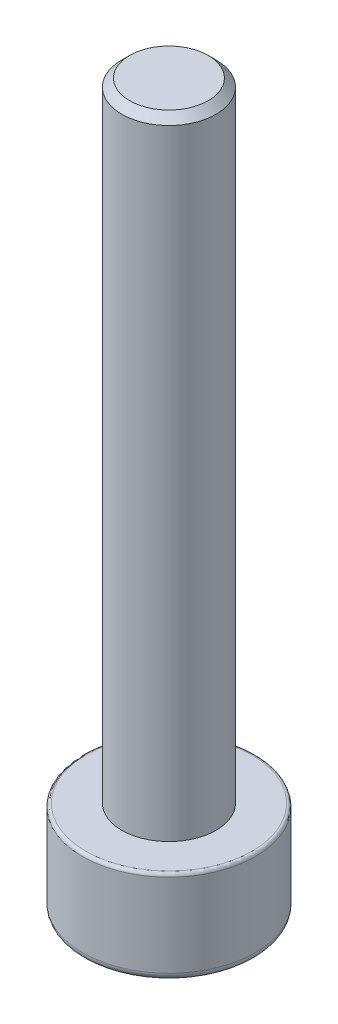
ISO-10303-21;
HEADER;
FILE_DESCRIPTION(('STEP AP214'),'2;1');
FILE_NAME('part.step','',(''),(''),'','','');
FILE_SCHEMA(('AUTOMOTIVE_DESIGN { 1 0 10303 214 1 1 1 1 }'));
ENDSEC;
DATA;
#1=APPLICATION_CONTEXT('core data for automotive mechanical design processes');
#2=APPLICATION_PROTOCOL_DEFINITION('international standard','automotive_design',2000,#1);
#3=PRODUCT_CONTEXT('',#1,'mechanical');
#4=PRODUCT('Part','Part','',(#3));
#5=PRODUCT_RELATED_PRODUCT_CATEGORY('part','',(#4));
#6=PRODUCT_DEFINITION_FORMATION('','',#4);
#7=PRODUCT_DEFINITION_CONTEXT('part definition',#1,'design');
#8=PRODUCT_DEFINITION('design','',#6,#7);
#9=PRODUCT_DEFINITION_SHAPE('','',#8);
#10=(LENGTH_UNIT() NAMED_UNIT(*) SI_UNIT(.MILLI.,.METRE.));
#11=(NAMED_UNIT(*) PLANE_ANGLE_UNIT() SI_UNIT($,.RADIAN.));
#12=(NAMED_UNIT(*) SI_UNIT($,.STERADIAN.) SOLID_ANGLE_UNIT());
#13=UNCERTAINTY_MEASURE_WITH_UNIT(LENGTH_MEASURE(1.E-05),#10,'distance_accuracy_value','');
#14=(GEOMETRIC_REPRESENTATION_CONTEXT(3) GLOBAL_UNCERTAINTY_ASSIGNED_CONTEXT((#13)) GLOBAL_UNIT_ASSIGNED_CONTEXT((#10,
#11,#12)) REPRESENTATION_CONTEXT('',''));
#15=CARTESIAN_POINT('',(0.,0.,0.));
#16=DIRECTION('',(0.,0.,1.));
#17=DIRECTION('',(1.,0.,0.));
#18=AXIS2_PLACEMENT_3D('',#15,#16,#17);
#19=CARTESIAN_POINT('',(0.,3.,0.));
#20=DIRECTION('',(0.,-1.,0.));
#21=DIRECTION('',(0.,0.,-1.));
#22=AXIS2_PLACEMENT_3D('',#19,#20,#21);
#23=CYLINDRICAL_SURFACE('',#22,2.75);
#24=CARTESIAN_POINT('',(0.,2.9,0.));
#25=DIRECTION('',(0.,1.,0.));
#26=DIRECTION('',(0.,0.,1.));
#27=AXIS2_PLACEMENT_3D('',#24,#25,#26);
#28=CIRCLE('',#27,2.75);
#29=CARTESIAN_POINT('',(0.,2.9,2.75));
#30=VERTEX_POINT('',#29);
#31=EDGE_CURVE('E11',#30,#30,#28,.F.);
#32=ORIENTED_EDGE('',*,*,#31,.T.);
#33=EDGE_LOOP('',(#32));
#34=FACE_BOUND('',#33,.T.);
#35=CARTESIAN_POINT('',(0.,0.25,0.));
#36=DIRECTION('',(0.,1.,0.));
#37=DIRECTION('',(0.,0.,1.));
#38=AXIS2_PLACEMENT_3D('',#35,#36,#37);
#39=CIRCLE('',#38,2.75);
#40=CARTESIAN_POINT('',(0.,0.25,2.75));
#41=VERTEX_POINT('',#40);
#42=EDGE_CURVE('E177',#41,#41,#39,.T.);
#43=ORIENTED_EDGE('',*,*,#42,.T.);
#44=EDGE_LOOP('',(#43));
#45=FACE_BOUND('',#44,.T.);
#46=ADVANCED_FACE('F33',(#34,#45),#23,.T.);
#47=CARTESIAN_POINT('',(0.,3.,0.));
#48=DIRECTION('',(0.,1.,0.));
#49=DIRECTION('',(0.,0.,1.));
#50=AXIS2_PLACEMENT_3D('',#47,#48,#49);
#51=PLANE('',#50);
#52=CARTESIAN_POINT('',(0.,3.,0.));
#53=DIRECTION('',(0.,1.,0.));
#54=DIRECTION('',(0.,0.,1.));
#55=AXIS2_PLACEMENT_3D('',#52,#53,#54);
#56=CIRCLE('',#55,2.65);
#57=CARTESIAN_POINT('',(0.,3.,2.65));
#58=VERTEX_POINT('',#57);
#59=EDGE_CURVE('E41',#58,#58,#56,.T.);
#60=ORIENTED_EDGE('',*,*,#59,.T.);
#61=EDGE_LOOP('',(#60));
#62=FACE_BOUND('',#61,.T.);
#63=CARTESIAN_POINT('',(0.,3.,0.));
#64=DIRECTION('',(0.,1.,0.));
#65=DIRECTION('',(0.,0.,1.));
#66=AXIS2_PLACEMENT_3D('',#63,#64,#65);
#67=CIRCLE('',#66,1.5);
#68=CARTESIAN_POINT('',(0.,3.,1.5));
#69=VERTEX_POINT('',#68);
#70=EDGE_CURVE('E141',#69,#69,#67,.T.);
#71=ORIENTED_EDGE('',*,*,#70,.F.);
#72=EDGE_LOOP('',(#71));
#73=FACE_BOUND('',#72,.T.);
#74=ADVANCED_FACE('F203',(#62,#73),#51,.T.);
#75=CARTESIAN_POINT('',(0.,0.,0.));
#76=DIRECTION('',(0.,1.,0.));
#77=DIRECTION('',(0.,0.,1.));
#78=AXIS2_PLACEMENT_3D('',#75,#76,#77);
#79=PLANE('',#78);
#80=CARTESIAN_POINT('',(0.,0.,0.));
#81=DIRECTION('',(0.,1.,0.));
#82=DIRECTION('',(0.,0.,1.));
#83=AXIS2_PLACEMENT_3D('',#80,#81,#82);
#84=CIRCLE('',#83,2.5);
#85=CARTESIAN_POINT('',(0.,0.,2.5));
#86=VERTEX_POINT('',#85);
#87=EDGE_CURVE('E192',#86,#86,#84,.F.);
#88=ORIENTED_EDGE('',*,*,#87,.T.);
#89=EDGE_LOOP('',(#88));
#90=FACE_BOUND('',#89,.T.);
#91=DIRECTION('',(-0.69197693122312,0.,-0.721919612321922));
#92=VECTOR('',#91,1.);
#93=CARTESIAN_POINT('',(1.02450088015783,0.,-0.982008194523005));
#94=LINE('',#93,#92);
#95=CARTESIAN_POINT('',(1.5914635756121,0.,-0.390512335578875));
#96=VERTEX_POINT('',#95);
#97=CARTESIAN_POINT('',(0.457538184703552,0.,-1.57350405346713));
#98=VERTEX_POINT('',#97);
#99=EDGE_CURVE('E156',#96,#98,#94,.T.);
#100=ORIENTED_EDGE('',*,*,#99,.T.);
#101=DIRECTION('',(-0.971189189372558,0.,0.238309795111058));
#102=VECTOR('',#101,1.);
#103=CARTESIAN_POINT('',(-0.338193603102499,0.,-1.3782478856777));
#104=LINE('',#103,#102);
#105=CARTESIAN_POINT('',(-1.13392539090855,0.,-1.18299171788826));
#106=VERTEX_POINT('',#105);
#107=EDGE_CURVE('E166',#98,#106,#104,.T.);
#108=ORIENTED_EDGE('',*,*,#107,.T.);
#109=DIRECTION('',(-0.279212258149438,0.,0.96022940743298));
#110=VECTOR('',#109,1.);
#111=CARTESIAN_POINT('',(-1.36269448326033,0.,-0.396239691154692));
#112=LINE('',#111,#110);
#113=CARTESIAN_POINT('',(-1.5914635756121,0.,0.390512335578874));
#114=VERTEX_POINT('',#113);
#115=EDGE_CURVE('E164',#106,#114,#112,.T.);
#116=ORIENTED_EDGE('',*,*,#115,.T.);
#117=DIRECTION('',(0.69197693122312,0.,0.721919612321922));
#118=VECTOR('',#117,1.);
#119=CARTESIAN_POINT('',(-1.02450088015783,0.,0.982008194523004));
#120=LINE('',#119,#118);
#121=CARTESIAN_POINT('',(-0.457538184703551,0.,1.57350405346713));
#122=VERTEX_POINT('',#121);
#123=EDGE_CURVE('E162',#114,#122,#120,.T.);
#124=ORIENTED_EDGE('',*,*,#123,.T.);
#125=DIRECTION('',(0.971189189372558,0.,-0.238309795111058));
#126=VECTOR('',#125,1.);
#127=CARTESIAN_POINT('',(0.338193603102499,0.,1.3782478856777));
#128=LINE('',#127,#126);
#129=CARTESIAN_POINT('',(1.13392539090855,0.,1.18299171788826));
#130=VERTEX_POINT('',#129);
#131=EDGE_CURVE('E160',#122,#130,#128,.T.);
#132=ORIENTED_EDGE('',*,*,#131,.T.);
#133=DIRECTION('',(0.279212258149438,0.,-0.96022940743298));
#134=VECTOR('',#133,1.);
#135=CARTESIAN_POINT('',(1.36269448326033,0.,0.396239691154693));
#136=LINE('',#135,#134);
#137=EDGE_CURVE('E158',#130,#96,#136,.T.);
#138=ORIENTED_EDGE('',*,*,#137,.T.);
#139=EDGE_LOOP('',(#100,#108,#116,#124,#132,#138));
#140=FACE_BOUND('',#139,.T.);
#141=ADVANCED_FACE('F221',(#90,#140),#79,.F.);
#142=CARTESIAN_POINT('',(0.,23.,0.));
#143=DIRECTION('',(0.,-1.,0.));
#144=DIRECTION('',(0.,0.,-1.));
#145=AXIS2_PLACEMENT_3D('',#142,#143,#144);
#146=CYLINDRICAL_SURFACE('',#145,1.5);
#147=CARTESIAN_POINT('',(0.,22.75,0.));
#148=DIRECTION('',(0.,1.,0.));
#149=DIRECTION('',(0.,0.,1.));
#150=AXIS2_PLACEMENT_3D('',#147,#148,#149);
#151=CIRCLE('',#150,1.5);
#152=CARTESIAN_POINT('',(0.,22.75,1.5));
#153=VERTEX_POINT('',#152);
#154=EDGE_CURVE('E198',#153,#153,#151,.F.);
#155=ORIENTED_EDGE('',*,*,#154,.T.);
#156=EDGE_LOOP('',(#155));
#157=FACE_BOUND('',#156,.T.);
#158=ORIENTED_EDGE('',*,*,#70,.T.);
#159=EDGE_LOOP('',(#158));
#160=FACE_BOUND('',#159,.T.);
#161=ADVANCED_FACE('F260',(#157,#160),#146,.T.);
#162=CARTESIAN_POINT('',(0.,23.,0.));
#163=DIRECTION('',(0.,1.,0.));
#164=DIRECTION('',(0.,0.,1.));
#165=AXIS2_PLACEMENT_3D('',#162,#163,#164);
#166=PLANE('',#165);
#167=CARTESIAN_POINT('',(0.,23.,0.));
#168=DIRECTION('',(0.,1.,0.));
#169=DIRECTION('',(0.,0.,1.));
#170=AXIS2_PLACEMENT_3D('',#167,#168,#169);
#171=CIRCLE('',#170,1.24999999999999);
#172=CARTESIAN_POINT('',(0.,23.,1.24999999999999));
#173=VERTEX_POINT('',#172);
#174=EDGE_CURVE('E195',#173,#173,#171,.T.);
#175=ORIENTED_EDGE('',*,*,#174,.T.);
#176=EDGE_LOOP('',(#175));
#177=FACE_BOUND('',#176,.T.);
#178=ADVANCED_FACE('F299',(#177),#166,.T.);
#179=CARTESIAN_POINT('',(1.31110540565295,1.5,-0.321718223399928));
#180=DIRECTION('',(0.96022940743298,0.,0.279212258149438));
#181=DIRECTION('',(0.279212258149438,0.,-0.96022940743298));
#182=AXIS2_PLACEMENT_3D('',#179,#180,#181);
#183=PLANE('',#182);
#184=DIRECTION('',(0.,-1.,0.));
#185=VECTOR('',#184,1.);
#186=CARTESIAN_POINT('',(1.31110540565295,1.5,-0.321718223399928));
#187=LINE('',#186,#185);
#188=CARTESIAN_POINT('',(1.31110540565295,1.5,-0.321718223399928));
#189=VERTEX_POINT('',#188);
#190=CARTESIAN_POINT('',(1.31110540565295,0.25,-0.321718223399928));
#191=VERTEX_POINT('',#190);
#192=EDGE_CURVE('E139',#189,#191,#187,.T.);
#193=ORIENTED_EDGE('',*,*,#192,.T.);
#194=DIRECTION('',(-0.279212258149438,0.,0.96022940743298));
#195=VECTOR('',#194,1.);
#196=CARTESIAN_POINT('',(1.31110540565295,0.25,-0.321718223399928));
#197=LINE('',#196,#195);
#198=CARTESIAN_POINT('',(0.934168857151212,0.25,0.974591476634595));
#199=VERTEX_POINT('',#198);
#200=EDGE_CURVE('E55',#191,#199,#197,.T.);
#201=ORIENTED_EDGE('',*,*,#200,.T.);
#202=DIRECTION('',(0.,-1.,0.));
#203=VECTOR('',#202,1.);
#204=CARTESIAN_POINT('',(0.934168857151212,1.5,0.974591476634595));
#205=LINE('',#204,#203);
#206=CARTESIAN_POINT('',(0.934168857151212,1.5,0.974591476634595));
#207=VERTEX_POINT('',#206);
#208=EDGE_CURVE('E103',#207,#199,#205,.T.);
#209=ORIENTED_EDGE('',*,*,#208,.F.);
#210=DIRECTION('',(-0.279212258149438,0.,0.96022940743298));
#211=VECTOR('',#210,1.);
#212=CARTESIAN_POINT('',(1.31110540565295,1.5,-0.321718223399928));
#213=LINE('',#212,#211);
#214=EDGE_CURVE('E107',#189,#207,#213,.T.);
#215=ORIENTED_EDGE('',*,*,#214,.F.);
#216=EDGE_LOOP('',(#193,#201,#209,#215));
#217=FACE_BOUND('',#216,.T.);
#218=ADVANCED_FACE('F105',(#217),#183,.F.);
#219=CARTESIAN_POINT('',(0.376936548501741,1.5,-1.29630970003452));
#220=DIRECTION('',(0.721919612321922,0.,-0.69197693122312));
#221=DIRECTION('',(-0.69197693122312,0.,-0.721919612321922));
#222=AXIS2_PLACEMENT_3D('',#219,#220,#221);
#223=PLANE('',#222);
#224=DIRECTION('',(0.,-1.,0.));
#225=VECTOR('',#224,1.);
#226=CARTESIAN_POINT('',(0.376936548501741,1.5,-1.29630970003452));
#227=LINE('',#226,#225);
#228=CARTESIAN_POINT('',(0.376936548501741,1.5,-1.29630970003452));
#229=VERTEX_POINT('',#228);
#230=CARTESIAN_POINT('',(0.376936548501741,0.25,-1.29630970003452));
#231=VERTEX_POINT('',#230);
#232=EDGE_CURVE('E142',#229,#231,#227,.T.);
#233=ORIENTED_EDGE('',*,*,#232,.T.);
#234=DIRECTION('',(0.69197693122312,0.,0.721919612321922));
#235=VECTOR('',#234,1.);
#236=CARTESIAN_POINT('',(0.376936548501741,0.25,-1.29630970003452));
#237=LINE('',#236,#235);
#238=EDGE_CURVE('E48',#231,#191,#237,.T.);
#239=ORIENTED_EDGE('',*,*,#238,.T.);
#240=ORIENTED_EDGE('',*,*,#192,.F.);
#241=DIRECTION('',(0.69197693122312,0.,0.721919612321922));
#242=VECTOR('',#241,1.);
#243=CARTESIAN_POINT('',(0.376936548501741,1.5,-1.29630970003452));
#244=LINE('',#243,#242);
#245=EDGE_CURVE('E112',#229,#189,#244,.T.);
#246=ORIENTED_EDGE('',*,*,#245,.F.);
#247=EDGE_LOOP('',(#233,#239,#240,#246));
#248=FACE_BOUND('',#247,.T.);
#249=ADVANCED_FACE('F272',(#248),#223,.F.);
#250=CARTESIAN_POINT('',(-0.934168857151211,1.5,-0.974591476634595));
#251=DIRECTION('',(-0.238309795111058,0.,-0.971189189372557));
#252=DIRECTION('',(-0.971189189372558,0.,0.238309795111058));
#253=AXIS2_PLACEMENT_3D('',#250,#251,#252);
#254=PLANE('',#253);
#255=DIRECTION('',(0.,-1.,0.));
#256=VECTOR('',#255,1.);
#257=CARTESIAN_POINT('',(-0.934168857151211,1.5,-0.974591476634595));
#258=LINE('',#257,#256);
#259=CARTESIAN_POINT('',(-0.934168857151211,1.5,-0.974591476634595));
#260=VERTEX_POINT('',#259);
#261=CARTESIAN_POINT('',(-0.934168857151211,0.25,-0.974591476634595));
#262=VERTEX_POINT('',#261);
#263=EDGE_CURVE('E144',#260,#262,#258,.T.);
#264=ORIENTED_EDGE('',*,*,#263,.T.);
#265=DIRECTION('',(0.971189189372558,0.,-0.238309795111058));
#266=VECTOR('',#265,1.);
#267=CARTESIAN_POINT('',(-0.934168857151211,0.25,-0.974591476634595));
#268=LINE('',#267,#266);
#269=EDGE_CURVE('E153',#262,#231,#268,.T.);
#270=ORIENTED_EDGE('',*,*,#269,.T.);
#271=ORIENTED_EDGE('',*,*,#232,.F.);
#272=DIRECTION('',(0.971189189372558,0.,-0.238309795111058));
#273=VECTOR('',#272,1.);
#274=CARTESIAN_POINT('',(-0.934168857151211,1.5,-0.974591476634595));
#275=LINE('',#274,#273);
#276=EDGE_CURVE('E136',#260,#229,#275,.T.);
#277=ORIENTED_EDGE('',*,*,#276,.F.);
#278=EDGE_LOOP('',(#264,#270,#271,#277));
#279=FACE_BOUND('',#278,.T.);
#280=ADVANCED_FACE('F270',(#279),#254,.F.);
#281=CARTESIAN_POINT('',(-1.31110540565295,1.5,0.321718223399928));
#282=DIRECTION('',(-0.96022940743298,0.,-0.279212258149438));
#283=DIRECTION('',(-0.279212258149438,0.,0.96022940743298));
#284=AXIS2_PLACEMENT_3D('',#281,#282,#283);
#285=PLANE('',#284);
#286=DIRECTION('',(0.,-1.,0.));
#287=VECTOR('',#286,1.);
#288=CARTESIAN_POINT('',(-1.31110540565295,1.5,0.321718223399928));
#289=LINE('',#288,#287);
#290=CARTESIAN_POINT('',(-1.31110540565295,1.5,0.321718223399928));
#291=VERTEX_POINT('',#290);
#292=CARTESIAN_POINT('',(-1.31110540565295,0.25,0.321718223399928));
#293=VERTEX_POINT('',#292);
#294=EDGE_CURVE('E147',#291,#293,#289,.T.);
#295=ORIENTED_EDGE('',*,*,#294,.T.);
#296=DIRECTION('',(0.279212258149438,0.,-0.96022940743298));
#297=VECTOR('',#296,1.);
#298=CARTESIAN_POINT('',(-1.31110540565295,0.25,0.321718223399928));
#299=LINE('',#298,#297);
#300=EDGE_CURVE('E169',#293,#262,#299,.T.);
#301=ORIENTED_EDGE('',*,*,#300,.T.);
#302=ORIENTED_EDGE('',*,*,#263,.F.);
#303=DIRECTION('',(0.279212258149438,0.,-0.96022940743298));
#304=VECTOR('',#303,1.);
#305=CARTESIAN_POINT('',(-1.31110540565295,1.5,0.321718223399928));
#306=LINE('',#305,#304);
#307=EDGE_CURVE('E133',#291,#260,#306,.T.);
#308=ORIENTED_EDGE('',*,*,#307,.F.);
#309=EDGE_LOOP('',(#295,#301,#302,#308));
#310=FACE_BOUND('',#309,.T.);
#311=ADVANCED_FACE('F281',(#310),#285,.F.);
#312=CARTESIAN_POINT('',(-0.376936548501741,1.5,1.29630970003452));
#313=DIRECTION('',(-0.721919612321922,0.,0.69197693122312));
#314=DIRECTION('',(0.69197693122312,0.,0.721919612321922));
#315=AXIS2_PLACEMENT_3D('',#312,#313,#314);
#316=PLANE('',#315);
#317=DIRECTION('',(0.,-1.,0.));
#318=VECTOR('',#317,1.);
#319=CARTESIAN_POINT('',(-0.376936548501741,1.5,1.29630970003452));
#320=LINE('',#319,#318);
#321=CARTESIAN_POINT('',(-0.376936548501741,1.5,1.29630970003452));
#322=VERTEX_POINT('',#321);
#323=CARTESIAN_POINT('',(-0.376936548501741,0.25,1.29630970003452));
#324=VERTEX_POINT('',#323);
#325=EDGE_CURVE('E111',#322,#324,#320,.T.);
#326=ORIENTED_EDGE('',*,*,#325,.T.);
#327=DIRECTION('',(-0.69197693122312,0.,-0.721919612321922));
#328=VECTOR('',#327,1.);
#329=CARTESIAN_POINT('',(-0.376936548501741,0.25,1.29630970003452));
#330=LINE('',#329,#328);
#331=EDGE_CURVE('E171',#324,#293,#330,.T.);
#332=ORIENTED_EDGE('',*,*,#331,.T.);
#333=ORIENTED_EDGE('',*,*,#294,.F.);
#334=DIRECTION('',(-0.69197693122312,0.,-0.721919612321922));
#335=VECTOR('',#334,1.);
#336=CARTESIAN_POINT('',(-0.376936548501741,1.5,1.29630970003452));
#337=LINE('',#336,#335);
#338=EDGE_CURVE('E121',#322,#291,#337,.T.);
#339=ORIENTED_EDGE('',*,*,#338,.F.);
#340=EDGE_LOOP('',(#326,#332,#333,#339));
#341=FACE_BOUND('',#340,.T.);
#342=ADVANCED_FACE('F278',(#341),#316,.F.);
#343=CARTESIAN_POINT('',(0.934168857151212,1.5,0.974591476634595));
#344=DIRECTION('',(0.238309795111058,0.,0.971189189372558));
#345=DIRECTION('',(0.971189189372558,0.,-0.238309795111058));
#346=AXIS2_PLACEMENT_3D('',#343,#344,#345);
#347=PLANE('',#346);
#348=ORIENTED_EDGE('',*,*,#208,.T.);
#349=DIRECTION('',(-0.971189189372558,0.,0.238309795111058));
#350=VECTOR('',#349,1.);
#351=CARTESIAN_POINT('',(0.934168857151212,0.25,0.974591476634595));
#352=LINE('',#351,#350);
#353=EDGE_CURVE('E173',#199,#324,#352,.T.);
#354=ORIENTED_EDGE('',*,*,#353,.T.);
#355=ORIENTED_EDGE('',*,*,#325,.F.);
#356=DIRECTION('',(-0.971189189372557,0.,0.238309795111058));
#357=VECTOR('',#356,1.);
#358=CARTESIAN_POINT('',(0.934168857151212,1.5,0.974591476634595));
#359=LINE('',#358,#357);
#360=EDGE_CURVE('E115',#207,#322,#359,.T.);
#361=ORIENTED_EDGE('',*,*,#360,.F.);
#362=EDGE_LOOP('',(#348,#354,#355,#361));
#363=FACE_BOUND('',#362,.T.);
#364=ADVANCED_FACE('F116',(#363),#347,.F.);
#365=CARTESIAN_POINT('',(0.,1.5,0.));
#366=DIRECTION('',(0.,-1.,0.));
#367=DIRECTION('',(0.,0.,-1.));
#368=AXIS2_PLACEMENT_3D('',#365,#366,#367);
#369=PLANE('',#368);
#370=ORIENTED_EDGE('',*,*,#214,.T.);
#371=ORIENTED_EDGE('',*,*,#360,.T.);
#372=ORIENTED_EDGE('',*,*,#338,.T.);
#373=ORIENTED_EDGE('',*,*,#307,.T.);
#374=ORIENTED_EDGE('',*,*,#276,.T.);
#375=ORIENTED_EDGE('',*,*,#245,.T.);
#376=EDGE_LOOP('',(#370,#371,#372,#373,#374,#375));
#377=FACE_BOUND('',#376,.T.);
#378=ADVANCED_FACE('F123',(#377),#369,.T.);
#379=CARTESIAN_POINT('',(0.934168857151212,0.25,0.974591476634595));
#380=DIRECTION('',(0.168510472146207,0.707106781186545,0.686734461620404));
#381=DIRECTION('',(-0.971189189372558,0.,0.238309795111058));
#382=AXIS2_PLACEMENT_3D('',#379,#380,#381);
#383=PLANE('',#382);
#384=DIRECTION('',(-0.523085392288577,0.65465367070798,-0.545719931652559));
#385=VECTOR('',#384,1.);
#386=CARTESIAN_POINT('',(0.934168857151212,0.25,0.974591476634595));
#387=LINE('',#386,#385);
#388=EDGE_CURVE('E129',#130,#199,#387,.T.);
#389=ORIENTED_EDGE('',*,*,#388,.F.);
#390=ORIENTED_EDGE('',*,*,#131,.F.);
#391=DIRECTION('',(0.211064628018337,0.65465367070798,-0.725865203896735));
#392=VECTOR('',#391,1.);
#393=CARTESIAN_POINT('',(-0.376936548501741,0.25,1.29630970003452));
#394=LINE('',#393,#392);
#395=EDGE_CURVE('E126',#324,#122,#394,.F.);
#396=ORIENTED_EDGE('',*,*,#395,.F.);
#397=ORIENTED_EDGE('',*,*,#353,.F.);
#398=EDGE_LOOP('',(#389,#390,#396,#397));
#399=FACE_BOUND('',#398,.T.);
#400=ADVANCED_FACE('F245',(#399),#383,.F.);
#401=CARTESIAN_POINT('',(-0.376936548501741,0.25,1.29630970003452));
#402=DIRECTION('',(-0.510474253344396,0.707106781186545,0.489301580492527));
#403=DIRECTION('',(-0.69197693122312,0.,-0.721919612321922));
#404=AXIS2_PLACEMENT_3D('',#401,#402,#403);
#405=PLANE('',#404);
#406=ORIENTED_EDGE('',*,*,#395,.T.);
#407=ORIENTED_EDGE('',*,*,#123,.F.);
#408=DIRECTION('',(0.734150020306913,0.65465367070798,-0.180145272244175));
#409=VECTOR('',#408,1.);
#410=CARTESIAN_POINT('',(-1.31110540565295,0.25,0.321718223399928));
#411=LINE('',#410,#409);
#412=EDGE_CURVE('E185',#293,#114,#411,.F.);
#413=ORIENTED_EDGE('',*,*,#412,.F.);
#414=ORIENTED_EDGE('',*,*,#331,.F.);
#415=EDGE_LOOP('',(#406,#407,#413,#414));
#416=FACE_BOUND('',#415,.T.);
#417=ADVANCED_FACE('F241',(#416),#405,.F.);
#418=CARTESIAN_POINT('',(1.31110540565295,0.25,-0.321718223399928));
#419=DIRECTION('',(0.678984725490602,0.707106781186545,0.197432881127877));
#420=DIRECTION('',(-0.279212258149438,0.,0.96022940743298));
#421=AXIS2_PLACEMENT_3D('',#418,#419,#420);
#422=PLANE('',#421);
#423=ORIENTED_EDGE('',*,*,#388,.T.);
#424=ORIENTED_EDGE('',*,*,#200,.F.);
#425=DIRECTION('',(-0.734150020306913,0.65465367070798,0.180145272244175));
#426=VECTOR('',#425,1.);
#427=CARTESIAN_POINT('',(1.31110540565295,0.25,-0.321718223399928));
#428=LINE('',#427,#426);
#429=EDGE_CURVE('E182',#96,#191,#428,.T.);
#430=ORIENTED_EDGE('',*,*,#429,.F.);
#431=ORIENTED_EDGE('',*,*,#137,.F.);
#432=EDGE_LOOP('',(#423,#424,#430,#431));
#433=FACE_BOUND('',#432,.T.);
#434=ADVANCED_FACE('F237',(#433),#422,.F.);
#435=CARTESIAN_POINT('',(-1.31110540565295,0.25,0.321718223399928));
#436=DIRECTION('',(-0.678984725490602,0.707106781186545,-0.197432881127877));
#437=DIRECTION('',(0.279212258149438,0.,-0.96022940743298));
#438=AXIS2_PLACEMENT_3D('',#435,#436,#437);
#439=PLANE('',#438);
#440=ORIENTED_EDGE('',*,*,#412,.T.);
#441=ORIENTED_EDGE('',*,*,#115,.F.);
#442=DIRECTION('',(0.523085392288576,0.65465367070798,0.54571993165256));
#443=VECTOR('',#442,1.);
#444=CARTESIAN_POINT('',(-0.934168857151211,0.25,-0.974591476634595));
#445=LINE('',#444,#443);
#446=EDGE_CURVE('E180',#262,#106,#445,.F.);
#447=ORIENTED_EDGE('',*,*,#446,.F.);
#448=ORIENTED_EDGE('',*,*,#300,.F.);
#449=EDGE_LOOP('',(#440,#441,#447,#448));
#450=FACE_BOUND('',#449,.T.);
#451=ADVANCED_FACE('F233',(#450),#439,.F.);
#452=CARTESIAN_POINT('',(0.376936548501741,0.25,-1.29630970003452));
#453=DIRECTION('',(0.510474253344396,0.707106781186545,-0.489301580492527));
#454=DIRECTION('',(0.69197693122312,0.,0.721919612321922));
#455=AXIS2_PLACEMENT_3D('',#452,#453,#454);
#456=PLANE('',#455);
#457=ORIENTED_EDGE('',*,*,#429,.T.);
#458=ORIENTED_EDGE('',*,*,#238,.F.);
#459=DIRECTION('',(0.211064628018337,-0.65465367070798,-0.725865203896735));
#460=VECTOR('',#459,1.);
#461=CARTESIAN_POINT('',(0.269240391786958,0.584038370031141,-0.925935500024662));
#462=LINE('',#461,#460);
#463=EDGE_CURVE('E178',#98,#231,#462,.F.);
#464=ORIENTED_EDGE('',*,*,#463,.F.);
#465=ORIENTED_EDGE('',*,*,#99,.F.);
#466=EDGE_LOOP('',(#457,#458,#464,#465));
#467=FACE_BOUND('',#466,.T.);
#468=ADVANCED_FACE('F229',(#467),#456,.F.);
#469=CARTESIAN_POINT('',(-0.934168857151211,0.25,-0.974591476634595));
#470=DIRECTION('',(-0.168510472146206,0.707106781186545,-0.686734461620404));
#471=DIRECTION('',(0.971189189372558,0.,-0.238309795111058));
#472=AXIS2_PLACEMENT_3D('',#469,#470,#471);
#473=PLANE('',#472);
#474=ORIENTED_EDGE('',*,*,#446,.T.);
#475=ORIENTED_EDGE('',*,*,#107,.F.);
#476=ORIENTED_EDGE('',*,*,#463,.T.);
#477=ORIENTED_EDGE('',*,*,#269,.F.);
#478=EDGE_LOOP('',(#474,#475,#476,#477));
#479=FACE_BOUND('',#478,.T.);
#480=ADVANCED_FACE('F226',(#479),#473,.F.);
#481=CARTESIAN_POINT('',(0.,0.25,0.));
#482=DIRECTION('',(0.,1.,0.));
#483=DIRECTION('',(0.,0.,1.));
#484=AXIS2_PLACEMENT_3D('',#481,#482,#483);
#485=TOROIDAL_SURFACE('',#484,2.5,0.25);
#486=ORIENTED_EDGE('',*,*,#87,.F.);
#487=EDGE_LOOP('',(#486));
#488=FACE_BOUND('',#487,.T.);
#489=ORIENTED_EDGE('',*,*,#42,.F.);
#490=EDGE_LOOP('',(#489));
#491=FACE_BOUND('',#490,.T.);
#492=ADVANCED_FACE('F212',(#488,#491),#485,.T.);
#493=CARTESIAN_POINT('',(0.,23.,0.));
#494=DIRECTION('',(0.,-1.,0.));
#495=DIRECTION('',(0.,0.,-1.));
#496=AXIS2_PLACEMENT_3D('',#493,#494,#495);
#497=CONICAL_SURFACE('',#496,1.24999999999999,0.785398163397453);
#498=ORIENTED_EDGE('',*,*,#154,.F.);
#499=EDGE_LOOP('',(#498));
#500=FACE_BOUND('',#499,.T.);
#501=ORIENTED_EDGE('',*,*,#174,.F.);
#502=EDGE_LOOP('',(#501));
#503=FACE_BOUND('',#502,.T.);
#504=ADVANCED_FACE('F207',(#500,#503),#497,.T.);
#505=CARTESIAN_POINT('',(0.,2.9,0.));
#506=DIRECTION('',(0.,1.,0.));
#507=DIRECTION('',(0.,0.,1.));
#508=AXIS2_PLACEMENT_3D('',#505,#506,#507);
#509=TOROIDAL_SURFACE('',#508,2.65,0.1);
#510=ORIENTED_EDGE('',*,*,#31,.F.);
#511=EDGE_LOOP('',(#510));
#512=FACE_BOUND('',#511,.T.);
#513=ORIENTED_EDGE('',*,*,#59,.F.);
#514=EDGE_LOOP('',(#513));
#515=FACE_BOUND('',#514,.T.);
#516=ADVANCED_FACE('F35',(#512,#515),#509,.T.);
#517=CLOSED_SHELL('',(#46,#74,#141,#161,#178,#218,#249,#280,#311,#342,#364,#378,#400,#417,#434,
#451,#468,#480,#492,#504,#516));
#518=MANIFOLD_SOLID_BREP('B2',#517);
#519=ADVANCED_BREP_SHAPE_REPRESENTATION('',(#18,#518),#14);
#520=SHAPE_DEFINITION_REPRESENTATION(#9,#519);
ENDSEC;
END-ISO-10303-21;
